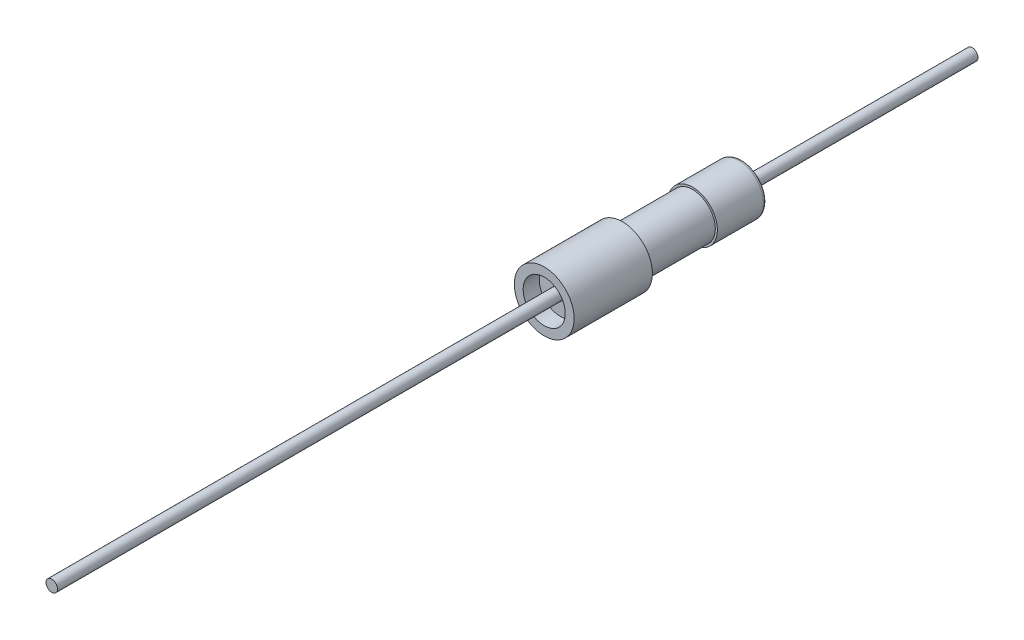
ISO-10303-21;
HEADER;
FILE_DESCRIPTION(('STEP AP214'),'2;1');
FILE_NAME('part.step','',(''),(''),'','','');
FILE_SCHEMA(('AUTOMOTIVE_DESIGN { 1 0 10303 214 1 1 1 1 }'));
ENDSEC;
DATA;
#1=APPLICATION_CONTEXT('core data for automotive mechanical design processes');
#2=APPLICATION_PROTOCOL_DEFINITION('international standard','automotive_design',2000,#1);
#3=PRODUCT_CONTEXT('',#1,'mechanical');
#4=PRODUCT('Part','Part','',(#3));
#5=PRODUCT_RELATED_PRODUCT_CATEGORY('part','',(#4));
#6=PRODUCT_DEFINITION_FORMATION('','',#4);
#7=PRODUCT_DEFINITION_CONTEXT('part definition',#1,'design');
#8=PRODUCT_DEFINITION('design','',#6,#7);
#9=PRODUCT_DEFINITION_SHAPE('','',#8);
#10=(LENGTH_UNIT() NAMED_UNIT(*) SI_UNIT(.MILLI.,.METRE.));
#11=(NAMED_UNIT(*) PLANE_ANGLE_UNIT() SI_UNIT($,.RADIAN.));
#12=(NAMED_UNIT(*) SI_UNIT($,.STERADIAN.) SOLID_ANGLE_UNIT());
#13=UNCERTAINTY_MEASURE_WITH_UNIT(LENGTH_MEASURE(1.E-05),#10,'distance_accuracy_value','');
#14=(GEOMETRIC_REPRESENTATION_CONTEXT(3) GLOBAL_UNCERTAINTY_ASSIGNED_CONTEXT((#13)) GLOBAL_UNIT_ASSIGNED_CONTEXT((#10,
#11,#12)) REPRESENTATION_CONTEXT('',''));
#15=CARTESIAN_POINT('',(0.,0.,0.));
#16=DIRECTION('',(0.,0.,1.));
#17=DIRECTION('',(1.,0.,0.));
#18=AXIS2_PLACEMENT_3D('',#15,#16,#17);
#19=CARTESIAN_POINT('',(0.,0.,-28.6996074020271));
#20=DIRECTION('',(0.,0.,1.));
#21=DIRECTION('',(0.,-1.,0.));
#22=AXIS2_PLACEMENT_3D('',#19,#20,#21);
#23=CYLINDRICAL_SURFACE('',#22,0.635000000000001);
#24=CARTESIAN_POINT('',(0.,0.,-3.29960740202708));
#25=DIRECTION('',(0.,0.,-1.));
#26=DIRECTION('',(0.,-1.,0.));
#27=AXIS2_PLACEMENT_3D('',#24,#25,#26);
#28=CIRCLE('',#27,0.635);
#29=CARTESIAN_POINT('',(0.,-0.63499999999998,-3.29960740202708));
#30=VERTEX_POINT('',#29);
#31=EDGE_CURVE('E10',#30,#30,#28,.T.);
#32=ORIENTED_EDGE('',*,*,#31,.T.);
#33=EDGE_LOOP('',(#32));
#34=FACE_BOUND('',#33,.T.);
#35=CARTESIAN_POINT('',(0.,0.,-28.6996074020271));
#36=DIRECTION('',(0.,0.,-1.));
#37=DIRECTION('',(0.,1.,0.));
#38=AXIS2_PLACEMENT_3D('',#35,#36,#37);
#39=CIRCLE('',#38,0.635000000000001);
#40=CARTESIAN_POINT('',(0.,0.635000000000018,-28.6996074020271));
#41=VERTEX_POINT('',#40);
#42=EDGE_CURVE('E31',#41,#41,#39,.T.);
#43=ORIENTED_EDGE('',*,*,#42,.F.);
#44=EDGE_LOOP('',(#43));
#45=FACE_BOUND('',#44,.T.);
#46=ADVANCED_FACE('F15',(#34,#45),#23,.T.);
#47=CARTESIAN_POINT('',(0.,0.,-28.6996074020271));
#48=DIRECTION('',(0.,0.,1.));
#49=DIRECTION('',(0.,-1.,0.));
#50=AXIS2_PLACEMENT_3D('',#47,#48,#49);
#51=CYLINDRICAL_SURFACE('',#50,0.635000000000001);
#52=CARTESIAN_POINT('',(0.,0.,72.9003925979729));
#53=DIRECTION('',(0.,0.,-1.));
#54=DIRECTION('',(0.,1.,0.));
#55=AXIS2_PLACEMENT_3D('',#52,#53,#54);
#56=CIRCLE('',#55,0.635000000000001);
#57=CARTESIAN_POINT('',(0.,0.635000000000028,72.9003925979729));
#58=VERTEX_POINT('',#57);
#59=EDGE_CURVE('E28',#58,#58,#56,.T.);
#60=ORIENTED_EDGE('',*,*,#59,.T.);
#61=EDGE_LOOP('',(#60));
#62=FACE_BOUND('',#61,.T.);
#63=CARTESIAN_POINT('',(0.,0.,-2.4698304249224));
#64=DIRECTION('',(0.,0.,1.));
#65=DIRECTION('',(0.,-1.,0.));
#66=AXIS2_PLACEMENT_3D('',#63,#64,#65);
#67=CIRCLE('',#66,0.635);
#68=CARTESIAN_POINT('',(-0.0490911625400173,0.633099563860588,-2.4698304249224));
#69=VERTEX_POINT('',#68);
#70=EDGE_CURVE('E23',#69,#69,#67,.T.);
#71=ORIENTED_EDGE('',*,*,#70,.T.);
#72=EDGE_LOOP('',(#71));
#73=FACE_BOUND('',#72,.T.);
#74=ADVANCED_FACE('F178',(#62,#73),#51,.T.);
#75=CARTESIAN_POINT('',(0.,0.,-35.0460466543635));
#76=DIRECTION('',(0.,0.,-1.));
#77=DIRECTION('',(-0.449884450199801,-0.893086771522467,0.));
#78=AXIS2_PLACEMENT_3D('',#75,#76,#77);
#79=CYLINDRICAL_SURFACE('',#78,2.32409999999999);
#80=CARTESIAN_POINT('',(0.,0.,16.764));
#81=DIRECTION('',(0.,0.,-1.));
#82=DIRECTION('',(1.,0.,0.));
#83=AXIS2_PLACEMENT_3D('',#80,#81,#82);
#84=CIRCLE('',#83,2.32409999999999);
#85=CARTESIAN_POINT('',(2.32409999999999,0.,16.764));
#86=VERTEX_POINT('',#85);
#87=EDGE_CURVE('E35',#86,#86,#84,.T.);
#88=ORIENTED_EDGE('',*,*,#87,.T.);
#89=EDGE_LOOP('',(#88));
#90=FACE_BOUND('',#89,.T.);
#91=CARTESIAN_POINT('',(0.,0.,18.5443925979729));
#92=DIRECTION('',(0.,0.,-1.));
#93=DIRECTION('',(-0.449884450199801,-0.893086771522467,0.));
#94=AXIS2_PLACEMENT_3D('',#91,#92,#93);
#95=CIRCLE('',#94,2.32409999999999);
#96=CARTESIAN_POINT('',(-1.04557645070935,-2.07562296569535,18.5443925979729));
#97=VERTEX_POINT('',#96);
#98=EDGE_CURVE('E36',#97,#97,#95,.T.);
#99=ORIENTED_EDGE('',*,*,#98,.F.);
#100=EDGE_LOOP('',(#99));
#101=FACE_BOUND('',#100,.T.);
#102=ADVANCED_FACE('F174',(#90,#101),#79,.F.);
#103=CARTESIAN_POINT('',(0.,0.,-19.6873550655785));
#104=DIRECTION('',(0.,0.,-1.));
#105=DIRECTION('',(-0.449884450199801,-0.893086771522467,0.));
#106=AXIS2_PLACEMENT_3D('',#103,#104,#105);
#107=CYLINDRICAL_SURFACE('',#106,3.302);
#108=CARTESIAN_POINT('',(0.,0.,9.90839259797293));
#109=DIRECTION('',(0.,0.,-1.));
#110=DIRECTION('',(-0.449884450199801,-0.893086771522467,0.));
#111=AXIS2_PLACEMENT_3D('',#108,#109,#110);
#112=CIRCLE('',#111,3.302);
#113=CARTESIAN_POINT('',(-1.48551845455974,-2.94897251956717,9.90839259797293));
#114=VERTEX_POINT('',#113);
#115=EDGE_CURVE('E39',#114,#114,#112,.T.);
#116=ORIENTED_EDGE('',*,*,#115,.F.);
#117=EDGE_LOOP('',(#116));
#118=FACE_BOUND('',#117,.T.);
#119=CARTESIAN_POINT('',(0.,0.,18.5443925979729));
#120=DIRECTION('',(0.,0.,-1.));
#121=DIRECTION('',(-0.449884450199801,-0.893086771522467,0.));
#122=AXIS2_PLACEMENT_3D('',#119,#120,#121);
#123=CIRCLE('',#122,3.302);
#124=CARTESIAN_POINT('',(-1.48551845455974,-2.94897251956717,18.5443925979729));
#125=VERTEX_POINT('',#124);
#126=EDGE_CURVE('E42',#125,#125,#123,.T.);
#127=ORIENTED_EDGE('',*,*,#126,.T.);
#128=EDGE_LOOP('',(#127));
#129=FACE_BOUND('',#128,.T.);
#130=ADVANCED_FACE('F170',(#118,#129),#107,.T.);
#131=CARTESIAN_POINT('',(0.,0.,16.764));
#132=DIRECTION('',(0.,0.,-1.));
#133=DIRECTION('',(-1.,0.,0.));
#134=AXIS2_PLACEMENT_3D('',#131,#132,#133);
#135=CYLINDRICAL_SURFACE('',#134,0.762);
#136=CARTESIAN_POINT('',(0.,0.,0.));
#137=DIRECTION('',(0.,0.,1.));
#138=DIRECTION('',(1.,0.,0.));
#139=AXIS2_PLACEMENT_3D('',#136,#137,#138);
#140=CIRCLE('',#139,0.762);
#141=CARTESIAN_POINT('',(0.762,0.,0.));
#142=VERTEX_POINT('',#141);
#143=EDGE_CURVE('E52',#142,#142,#140,.T.);
#144=ORIENTED_EDGE('',*,*,#143,.F.);
#145=EDGE_LOOP('',(#144));
#146=FACE_BOUND('',#145,.T.);
#147=CARTESIAN_POINT('',(0.,0.,16.764));
#148=DIRECTION('',(0.,0.,1.));
#149=DIRECTION('',(1.,0.,0.));
#150=AXIS2_PLACEMENT_3D('',#147,#148,#149);
#151=CIRCLE('',#150,0.762);
#152=CARTESIAN_POINT('',(0.762,0.,16.764));
#153=VERTEX_POINT('',#152);
#154=EDGE_CURVE('E45',#153,#153,#151,.T.);
#155=ORIENTED_EDGE('',*,*,#154,.T.);
#156=EDGE_LOOP('',(#155));
#157=FACE_BOUND('',#156,.T.);
#158=ADVANCED_FACE('F166',(#146,#157),#135,.F.);
#159=CARTESIAN_POINT('',(0.,0.,16.764));
#160=DIRECTION('',(0.,0.,-1.));
#161=DIRECTION('',(-1.,0.,0.));
#162=AXIS2_PLACEMENT_3D('',#159,#160,#161);
#163=CYLINDRICAL_SURFACE('',#162,2.5019);
#164=CARTESIAN_POINT('',(0.,0.,2.16139259797292));
#165=DIRECTION('',(0.,0.,1.));
#166=DIRECTION('',(0.,1.,0.));
#167=AXIS2_PLACEMENT_3D('',#164,#165,#166);
#168=CIRCLE('',#167,2.5019);
#169=CARTESIAN_POINT('',(0.,2.5019,2.16139259797292));
#170=VERTEX_POINT('',#169);
#171=EDGE_CURVE('E58',#170,#170,#168,.T.);
#172=ORIENTED_EDGE('',*,*,#171,.T.);
#173=EDGE_LOOP('',(#172));
#174=FACE_BOUND('',#173,.T.);
#175=CARTESIAN_POINT('',(0.,0.,9.90839259797293));
#176=DIRECTION('',(0.,0.,-1.));
#177=DIRECTION('',(0.,1.,0.));
#178=AXIS2_PLACEMENT_3D('',#175,#176,#177);
#179=CIRCLE('',#178,2.5019);
#180=CARTESIAN_POINT('',(0.,2.5019,9.90839259797293));
#181=VERTEX_POINT('',#180);
#182=EDGE_CURVE('E51',#181,#181,#179,.T.);
#183=ORIENTED_EDGE('',*,*,#182,.T.);
#184=EDGE_LOOP('',(#183));
#185=FACE_BOUND('',#184,.T.);
#186=ADVANCED_FACE('F162',(#174,#185),#163,.T.);
#187=CARTESIAN_POINT('',(0.,0.,-18.5396074020271));
#188=DIRECTION('',(0.,0.,-1.));
#189=DIRECTION('',(0.077308917385854,-0.997007187182032,0.));
#190=AXIS2_PLACEMENT_3D('',#187,#188,#189);
#191=CYLINDRICAL_SURFACE('',#190,2.0574);
#192=CARTESIAN_POINT('',(0.,0.,-1.64860740202708));
#193=DIRECTION('',(0.,0.,-1.));
#194=DIRECTION('',(0.077308917385854,-0.997007187182032,0.));
#195=AXIS2_PLACEMENT_3D('',#192,#193,#194);
#196=CIRCLE('',#195,2.0574);
#197=CARTESIAN_POINT('',(-0.159055366629656,2.05124258690831,-1.64860740202708));
#198=VERTEX_POINT('',#197);
#199=EDGE_CURVE('E61',#198,#198,#196,.T.);
#200=ORIENTED_EDGE('',*,*,#199,.T.);
#201=EDGE_LOOP('',(#200));
#202=FACE_BOUND('',#201,.T.);
#203=CARTESIAN_POINT('',(0.,0.,-0.22620740202708));
#204=DIRECTION('',(0.,0.,-1.));
#205=DIRECTION('',(0.077308917385854,-0.997007187182032,0.));
#206=AXIS2_PLACEMENT_3D('',#203,#204,#205);
#207=CIRCLE('',#206,2.0574);
#208=CARTESIAN_POINT('',(0.159055366629656,-2.05124258690832,-0.22620740202708));
#209=VERTEX_POINT('',#208);
#210=EDGE_CURVE('E62',#209,#209,#207,.T.);
#211=ORIENTED_EDGE('',*,*,#210,.F.);
#212=EDGE_LOOP('',(#211));
#213=FACE_BOUND('',#212,.T.);
#214=ADVANCED_FACE('F158',(#202,#213),#191,.F.);
#215=CARTESIAN_POINT('',(0.,0.,-18.5396074020271));
#216=DIRECTION('',(0.,0.,-1.));
#217=DIRECTION('',(0.0773089173858539,-0.997007187182032,0.));
#218=AXIS2_PLACEMENT_3D('',#215,#216,#217);
#219=CYLINDRICAL_SURFACE('',#218,2.7305);
#220=CARTESIAN_POINT('',(0.,0.,-2.91860740202708));
#221=DIRECTION('',(0.,0.,-1.));
#222=DIRECTION('',(0.0773089173858539,-0.997007187182032,0.));
#223=AXIS2_PLACEMENT_3D('',#220,#221,#222);
#224=CIRCLE('',#223,2.7305);
#225=CARTESIAN_POINT('',(0.211091998922074,-2.72232812460054,-2.91860740202708));
#226=VERTEX_POINT('',#225);
#227=EDGE_CURVE('E65',#226,#226,#224,.T.);
#228=ORIENTED_EDGE('',*,*,#227,.F.);
#229=EDGE_LOOP('',(#228));
#230=FACE_BOUND('',#229,.T.);
#231=CARTESIAN_POINT('',(0.,0.,2.16139259797292));
#232=DIRECTION('',(0.,0.,-1.));
#233=DIRECTION('',(0.077308917385854,-0.997007187182032,0.));
#234=AXIS2_PLACEMENT_3D('',#231,#232,#233);
#235=CIRCLE('',#234,2.7305);
#236=CARTESIAN_POINT('',(0.211091998922074,-2.72232812460054,2.16139259797292));
#237=VERTEX_POINT('',#236);
#238=EDGE_CURVE('E68',#237,#237,#235,.T.);
#239=ORIENTED_EDGE('',*,*,#238,.T.);
#240=EDGE_LOOP('',(#239));
#241=FACE_BOUND('',#240,.T.);
#242=ADVANCED_FACE('F154',(#230,#241),#219,.T.);
#243=CARTESIAN_POINT('',(0.,0.,-2.91860740202708));
#244=DIRECTION('',(0.,0.,-1.));
#245=DIRECTION('',(0.077308917385854,-0.997007187182032,0.));
#246=AXIS2_PLACEMENT_3D('',#243,#244,#245);
#247=TOROIDAL_SURFACE('',#246,2.3495,0.381);
#248=CARTESIAN_POINT('',(0.,0.,-3.29960740202708));
#249=DIRECTION('',(0.,0.,-1.));
#250=DIRECTION('',(0.0773089173858539,-0.997007187182032,0.));
#251=AXIS2_PLACEMENT_3D('',#248,#249,#250);
#252=CIRCLE('',#251,2.3495);
#253=CARTESIAN_POINT('',(0.181637301398064,-2.34246838628419,-3.29960740202708));
#254=VERTEX_POINT('',#253);
#255=EDGE_CURVE('E55',#254,#254,#252,.T.);
#256=ORIENTED_EDGE('',*,*,#255,.F.);
#257=EDGE_LOOP('',(#256));
#258=FACE_BOUND('',#257,.T.);
#259=ORIENTED_EDGE('',*,*,#227,.T.);
#260=EDGE_LOOP('',(#259));
#261=FACE_BOUND('',#260,.T.);
#262=ADVANCED_FACE('F150',(#258,#261),#247,.T.);
#263=CARTESIAN_POINT('',(0.,0.,-0.22620740202708));
#264=DIRECTION('',(0.,0.,1.));
#265=DIRECTION('',(-0.077308917385854,0.997007187182032,0.));
#266=AXIS2_PLACEMENT_3D('',#263,#264,#265);
#267=CONICAL_SURFACE('',#266,2.0574,0.785398163397444);
#268=CARTESIAN_POINT('',(0.,0.,0.));
#269=DIRECTION('',(0.,0.,-1.));
#270=DIRECTION('',(1.,0.,0.));
#271=AXIS2_PLACEMENT_3D('',#268,#269,#270);
#272=CIRCLE('',#271,2.28360740202708);
#273=CARTESIAN_POINT('',(2.28360740202708,0.,0.));
#274=VERTEX_POINT('',#273);
#275=EDGE_CURVE('E48',#274,#274,#272,.T.);
#276=ORIENTED_EDGE('',*,*,#275,.F.);
#277=EDGE_LOOP('',(#276));
#278=FACE_BOUND('',#277,.T.);
#279=ORIENTED_EDGE('',*,*,#210,.T.);
#280=EDGE_LOOP('',(#279));
#281=FACE_BOUND('',#280,.T.);
#282=ADVANCED_FACE('F146',(#278,#281),#267,.F.);
#283=CARTESIAN_POINT('',(0.,0.,-2.52848921227206));
#284=DIRECTION('',(0.,0.,1.));
#285=DIRECTION('',(-0.077308917385854,0.997007187182032,0.));
#286=AXIS2_PLACEMENT_3D('',#283,#284,#285);
#287=CONICAL_SURFACE('',#286,0.533400000000002,1.0471975511966);
#288=CARTESIAN_POINT('',(-0.159055366629656,2.05124258690831,-1.64860740202708));
#289=CARTESIAN_POINT('',(-0.157909906170389,2.03647026375157,-1.65716180851557));
#290=CARTESIAN_POINT('',(-0.156764445711122,2.02169794059482,-1.66571621500406));
#291=CARTESIAN_POINT('',(-0.154473524792588,1.99215329428132,-1.68282502798105));
#292=CARTESIAN_POINT('',(-0.153328064333321,1.97738097112458,-1.69137943446954));
#293=CARTESIAN_POINT('',(-0.151037143414787,1.94783632481108,-1.70848824744653));
#294=CARTESIAN_POINT('',(-0.14989168295552,1.93306400165434,-1.71704265393502));
#295=CARTESIAN_POINT('',(-0.147600762036985,1.90351935534084,-1.73415146691201));
#296=CARTESIAN_POINT('',(-0.146455301577718,1.88874703218409,-1.7427058734005));
#297=CARTESIAN_POINT('',(-0.144164380659184,1.8592023858706,-1.75981468637749));
#298=CARTESIAN_POINT('',(-0.143018920199917,1.84443006271385,-1.76836909286598));
#299=CARTESIAN_POINT('',(-0.140727999281383,1.81488541640036,-1.78547790584296));
#300=CARTESIAN_POINT('',(-0.139582538822116,1.80011309324361,-1.79403231233146));
#301=CARTESIAN_POINT('',(-0.137291617903582,1.77056844693012,-1.81114112530844));
#302=CARTESIAN_POINT('',(-0.136146157444315,1.75579612377337,-1.81969553179694));
#303=CARTESIAN_POINT('',(-0.133855236525781,1.72625147745988,-1.83680434477392));
#304=CARTESIAN_POINT('',(-0.132709776066513,1.71147915430313,-1.84535875126241));
#305=CARTESIAN_POINT('',(-0.130418855147979,1.68193450798963,-1.8624675642394));
#306=CARTESIAN_POINT('',(-0.129273394688712,1.66716218483289,-1.87102197072789));
#307=CARTESIAN_POINT('',(-0.126982473770178,1.63761753851939,-1.88813078370488));
#308=CARTESIAN_POINT('',(-0.125837013310911,1.62284521536265,-1.89668519019337));
#309=CARTESIAN_POINT('',(-0.123546092392377,1.59330056904915,-1.91379400317036));
#310=CARTESIAN_POINT('',(-0.12240063193311,1.5785282458924,-1.92234840965885));
#311=CARTESIAN_POINT('',(-0.120109711014576,1.54898359957891,-1.93945722263584));
#312=CARTESIAN_POINT('',(-0.118964250555309,1.53421127642216,-1.94801162912433));
#313=CARTESIAN_POINT('',(-0.116673329636774,1.50466663010867,-1.96512044210132));
#314=CARTESIAN_POINT('',(-0.115527869177507,1.48989430695192,-1.97367484858981));
#315=CARTESIAN_POINT('',(-0.113236948258973,1.46034966063843,-1.99078366156679));
#316=CARTESIAN_POINT('',(-0.112091487799706,1.44557733748168,-1.99933806805529));
#317=CARTESIAN_POINT('',(-0.109800566881172,1.41603269116819,-2.01644688103227));
#318=CARTESIAN_POINT('',(-0.108655106421905,1.40126036801144,-2.02500128752077));
#319=CARTESIAN_POINT('',(-0.106364185503371,1.37171572169794,-2.04211010049775));
#320=CARTESIAN_POINT('',(-0.105218725044104,1.3569433985412,-2.05066450698624));
#321=CARTESIAN_POINT('',(-0.10292780412557,1.3273987522277,-2.06777331996323));
#322=CARTESIAN_POINT('',(-0.101782343666303,1.31262642907096,-2.07632772645172));
#323=CARTESIAN_POINT('',(-0.0994914227477684,1.28308178275746,-2.09343653942871));
#324=CARTESIAN_POINT('',(-0.0983459622885013,1.26830945960071,-2.1019909459172));
#325=CARTESIAN_POINT('',(-0.0960550413699672,1.23876481328722,-2.11909975889419));
#326=CARTESIAN_POINT('',(-0.0949095809107001,1.22399249013047,-2.12765416538268));
#327=CARTESIAN_POINT('',(-0.092618659992166,1.19444784381698,-2.14476297835967));
#328=CARTESIAN_POINT('',(-0.0914731995328989,1.17967552066023,-2.15331738484816));
#329=CARTESIAN_POINT('',(-0.0891822786143647,1.15013087434674,-2.17042619782515));
#330=CARTESIAN_POINT('',(-0.0880368181550977,1.13535855118999,-2.17898060431364));
#331=CARTESIAN_POINT('',(-0.0857458972365635,1.1058139048765,-2.19608941729062));
#332=CARTESIAN_POINT('',(-0.0846004367772965,1.09104158171975,-2.20464382377912));
#333=CARTESIAN_POINT('',(-0.0823095158587623,1.06149693540625,-2.2217526367561));
#334=CARTESIAN_POINT('',(-0.0811640553994953,1.04672461224951,-2.2303070432446));
#335=CARTESIAN_POINT('',(-0.0788731344809611,1.01717996593601,-2.24741585622158));
#336=CARTESIAN_POINT('',(-0.077727674021694,1.00240764277927,-2.25597026271007));
#337=CARTESIAN_POINT('',(-0.0754367531031599,0.972862996465772,-2.27307907568706));
#338=CARTESIAN_POINT('',(-0.0742912926438928,0.958090673309024,-2.28163348217555));
#339=CARTESIAN_POINT('',(-0.0720003717253587,0.92854602699553,-2.29874229515254));
#340=CARTESIAN_POINT('',(-0.0708549112660916,0.913773703838783,-2.30729670164103));
#341=CARTESIAN_POINT('',(-0.0685639903475575,0.884229057525289,-2.32440551461802));
#342=CARTESIAN_POINT('',(-0.0674185298882904,0.869456734368542,-2.33295992110651));
#343=CARTESIAN_POINT('',(-0.0651276089697563,0.839912088055047,-2.3500687340835));
#344=CARTESIAN_POINT('',(-0.0639821485104892,0.8251397648983,-2.35862314057199));
#345=CARTESIAN_POINT('',(-0.061691227591955,0.795595118584806,-2.37573195354898));
#346=CARTESIAN_POINT('',(-0.060545767132688,0.780822795428059,-2.38428636003747));
#347=CARTESIAN_POINT('',(-0.0582548462141538,0.751278149114565,-2.40139517301445));
#348=CARTESIAN_POINT('',(-0.0571093857548868,0.736505825957818,-2.40994957950295));
#349=CARTESIAN_POINT('',(-0.0548184648363526,0.706961179644323,-2.42705839247993));
#350=CARTESIAN_POINT('',(-0.0536730043770855,0.692188856487576,-2.43561279896843));
#351=CARTESIAN_POINT('',(-0.0513820834585514,0.662644210174082,-2.45272161194541));
#352=CARTESIAN_POINT('',(-0.0502366229992843,0.647871887017335,-2.4612760184339));
#353=CARTESIAN_POINT('',(-0.0490911625400173,0.633099563860588,-2.4698304249224));
#354=B_SPLINE_CURVE_WITH_KNOTS('',3,(#288,#289,#290,#291,#292,#293,#294,#295,#296,#297,#298,
#299,#300,#301,#302,#303,#304,#305,#306,#307,#308,#309,#310,#311,#312,#313,#314,#315,#316,#317,
#318,#319,#320,#321,#322,#323,#324,#325,#326,#327,#328,#329,#330,#331,#332,#333,#334,#335,#336,
#337,#338,#339,#340,#341,#342,#343,#344,#345,#346,#347,#348,#349,#350,#351,#352,#353),
.UNSPECIFIED.,.F.,.F.,(4,2,2,2,2,2,2,2,2,2,2,2,2,2,2,2,2,2,2,2,2,2,2,2,2,2,2,2,2,2,2,2,4),(0.,
0.0513264389309578,0.102652877861916,0.153979316792873,0.205305755723831,0.256632194654789,
0.307958633585747,0.359285072516704,0.410611511447662,0.461937950378619,0.513264389309577,
0.564590828240535,0.615917267171493,0.667243706102451,0.718570145033408,0.769896583964366,
0.821223022895324,0.872549461826281,0.92387590075724,0.975202339688197,1.02652877861916,
1.07785521755011,1.12918165648107,1.18050809541203,1.23183453434299,1.28316097327394,
1.3344874122049,1.38581385113586,1.43714029006682,1.48846672899777,1.53979316792873,
1.59111960685969,1.64244604579065),.UNSPECIFIED.);
#355=EDGE_CURVE('BSEAM142',#198,#69,#354,.T.);
#356=ORIENTED_EDGE('',*,*,#199,.F.);
#357=ORIENTED_EDGE('',*,*,#70,.F.);
#358=ORIENTED_EDGE('',*,*,#355,.T.);
#359=ORIENTED_EDGE('',*,*,#355,.F.);
#360=EDGE_LOOP('',(#356,#358,#357,#359));
#361=FACE_BOUND('',#360,.T.);
#362=ADVANCED_FACE('F142',(#361),#287,.F.);
#363=CARTESIAN_POINT('',(-2.34246838628419,-0.181637301398066,-3.29960740202708));
#364=DIRECTION('',(0.,0.,1.));
#365=DIRECTION('',(-0.077308917385854,0.997007187182032,0.));
#366=AXIS2_PLACEMENT_3D('',#363,#364,#365);
#367=PLANE('',#366);
#368=ORIENTED_EDGE('',*,*,#255,.T.);
#369=EDGE_LOOP('',(#368));
#370=FACE_BOUND('',#369,.T.);
#371=ORIENTED_EDGE('',*,*,#31,.F.);
#372=EDGE_LOOP('',(#371));
#373=FACE_BOUND('',#372,.T.);
#374=ADVANCED_FACE('F138',(#370,#373),#367,.F.);
#375=CARTESIAN_POINT('',(-2.27915842989813,-0.176728185144064,2.16139259797292));
#376=DIRECTION('',(0.,0.,-1.));
#377=DIRECTION('',(0.077308917385854,-0.997007187182032,0.));
#378=AXIS2_PLACEMENT_3D('',#375,#376,#377);
#379=PLANE('',#378);
#380=ORIENTED_EDGE('',*,*,#238,.F.);
#381=EDGE_LOOP('',(#380));
#382=FACE_BOUND('',#381,.T.);
#383=ORIENTED_EDGE('',*,*,#171,.F.);
#384=EDGE_LOOP('',(#383));
#385=FACE_BOUND('',#384,.T.);
#386=ADVANCED_FACE('F134',(#382,#385),#379,.F.);
#387=CARTESIAN_POINT('',(0.,0.,0.));
#388=DIRECTION('',(0.,0.,1.));
#389=DIRECTION('',(1.,0.,0.));
#390=AXIS2_PLACEMENT_3D('',#387,#388,#389);
#391=PLANE('',#390);
#392=ORIENTED_EDGE('',*,*,#143,.T.);
#393=EDGE_LOOP('',(#392));
#394=FACE_BOUND('',#393,.T.);
#395=ORIENTED_EDGE('',*,*,#275,.T.);
#396=EDGE_LOOP('',(#395));
#397=FACE_BOUND('',#396,.T.);
#398=ADVANCED_FACE('F130',(#394,#397),#391,.F.);
#399=CARTESIAN_POINT('',(0.,0.,16.764));
#400=DIRECTION('',(0.,0.,1.));
#401=DIRECTION('',(1.,0.,0.));
#402=AXIS2_PLACEMENT_3D('',#399,#400,#401);
#403=PLANE('',#402);
#404=ORIENTED_EDGE('',*,*,#87,.F.);
#405=EDGE_LOOP('',(#404));
#406=FACE_BOUND('',#405,.T.);
#407=ORIENTED_EDGE('',*,*,#154,.F.);
#408=EDGE_LOOP('',(#407));
#409=FACE_BOUND('',#408,.T.);
#410=ADVANCED_FACE('F126',(#406,#409),#403,.T.);
#411=CARTESIAN_POINT('',(2.94897251956718,-1.48551845455973,9.90839259797293));
#412=DIRECTION('',(0.,0.,-1.));
#413=DIRECTION('',(-0.449884450199801,-0.893086771522467,0.));
#414=AXIS2_PLACEMENT_3D('',#411,#412,#413);
#415=PLANE('',#414);
#416=ORIENTED_EDGE('',*,*,#115,.T.);
#417=EDGE_LOOP('',(#416));
#418=FACE_BOUND('',#417,.T.);
#419=ORIENTED_EDGE('',*,*,#182,.F.);
#420=EDGE_LOOP('',(#419));
#421=FACE_BOUND('',#420,.T.);
#422=ADVANCED_FACE('F122',(#418,#421),#415,.T.);
#423=CARTESIAN_POINT('',(2.94897251956718,-1.48551845455973,18.5443925979729));
#424=DIRECTION('',(0.,0.,1.));
#425=DIRECTION('',(0.449884450199801,0.893086771522467,0.));
#426=AXIS2_PLACEMENT_3D('',#423,#424,#425);
#427=PLANE('',#426);
#428=ORIENTED_EDGE('',*,*,#98,.T.);
#429=EDGE_LOOP('',(#428));
#430=FACE_BOUND('',#429,.T.);
#431=ORIENTED_EDGE('',*,*,#126,.F.);
#432=EDGE_LOOP('',(#431));
#433=FACE_BOUND('',#432,.T.);
#434=ADVANCED_FACE('F118',(#430,#433),#427,.T.);
#435=CARTESIAN_POINT('',(0.,0.,72.9003925979729));
#436=DIRECTION('',(0.,0.,-1.));
#437=DIRECTION('',(0.,1.,0.));
#438=AXIS2_PLACEMENT_3D('',#435,#436,#437);
#439=PLANE('',#438);
#440=ORIENTED_EDGE('',*,*,#59,.F.);
#441=EDGE_LOOP('',(#440));
#442=FACE_BOUND('',#441,.T.);
#443=ADVANCED_FACE('F114',(#442),#439,.F.);
#444=CARTESIAN_POINT('',(0.,0.,-28.6996074020271));
#445=DIRECTION('',(0.,0.,-1.));
#446=DIRECTION('',(0.,1.,0.));
#447=AXIS2_PLACEMENT_3D('',#444,#445,#446);
#448=PLANE('',#447);
#449=ORIENTED_EDGE('',*,*,#42,.T.);
#450=EDGE_LOOP('',(#449));
#451=FACE_BOUND('',#450,.T.);
#452=ADVANCED_FACE('F112',(#451),#448,.T.);
#453=CLOSED_SHELL('',(#46,#74,#102,#130,#158,#186,#214,#242,#262,#282,#362,#374,#386,#398,#410,
#422,#434,#443,#452));
#454=CARTESIAN_POINT('',(0.,0.,13.8453925979729));
#455=DIRECTION('',(0.,0.,1.));
#456=DIRECTION('',(0.449884450199801,0.893086771522467,0.));
#457=AXIS2_PLACEMENT_3D('',#454,#455,#456);
#458=CONICAL_SURFACE('',#457,2.32409999999999,0.785398163397454);
#459=CARTESIAN_POINT('',(0.,0.,14.2898925979729));
#460=DIRECTION('',(0.,0.,-1.));
#461=DIRECTION('',(0.,-1.,0.));
#462=AXIS2_PLACEMENT_3D('',#459,#460,#461);
#463=CIRCLE('',#462,2.7686);
#464=CARTESIAN_POINT('',(0.,-2.76859999999999,14.2898925979729));
#465=VERTEX_POINT('',#464);
#466=EDGE_CURVE('E80',#465,#465,#463,.T.);
#467=ORIENTED_EDGE('',*,*,#466,.T.);
#468=EDGE_LOOP('',(#467));
#469=FACE_BOUND('',#468,.T.);
#470=CARTESIAN_POINT('',(0.,0.,14.0231925979729));
#471=DIRECTION('',(0.,0.,-1.));
#472=DIRECTION('',(0.,-1.,0.));
#473=AXIS2_PLACEMENT_3D('',#470,#471,#472);
#474=CIRCLE('',#473,2.5019);
#475=CARTESIAN_POINT('',(0.,-2.50189999999999,14.0231925979729));
#476=VERTEX_POINT('',#475);
#477=EDGE_CURVE('E77',#476,#476,#474,.T.);
#478=ORIENTED_EDGE('',*,*,#477,.F.);
#479=EDGE_LOOP('',(#478));
#480=FACE_BOUND('',#479,.T.);
#481=ADVANCED_FACE('F100',(#469,#480),#458,.T.);
#482=CARTESIAN_POINT('',(0.,0.,-19.6873550655785));
#483=DIRECTION('',(0.,0.,-1.));
#484=DIRECTION('',(-0.449884450199801,-0.893086771522467,0.));
#485=AXIS2_PLACEMENT_3D('',#482,#483,#484);
#486=CYLINDRICAL_SURFACE('',#485,2.7686);
#487=CARTESIAN_POINT('',(0.,0.,12.4483925979729));
#488=DIRECTION('',(0.,0.,-1.));
#489=DIRECTION('',(-0.449884450199801,-0.893086771522467,0.));
#490=AXIS2_PLACEMENT_3D('',#487,#488,#489);
#491=CIRCLE('',#490,2.7686);
#492=CARTESIAN_POINT('',(-1.24555008882317,-2.47260003563709,12.4483925979729));
#493=VERTEX_POINT('',#492);
#494=EDGE_CURVE('E82',#493,#493,#491,.T.);
#495=ORIENTED_EDGE('',*,*,#494,.T.);
#496=EDGE_LOOP('',(#495));
#497=FACE_BOUND('',#496,.T.);
#498=ORIENTED_EDGE('',*,*,#466,.F.);
#499=EDGE_LOOP('',(#498));
#500=FACE_BOUND('',#499,.T.);
#501=ADVANCED_FACE('F99',(#497,#500),#486,.F.);
#502=CARTESIAN_POINT('',(0.,0.,16.764));
#503=DIRECTION('',(0.,0.,-1.));
#504=DIRECTION('',(-1.,0.,0.));
#505=AXIS2_PLACEMENT_3D('',#502,#503,#504);
#506=CYLINDRICAL_SURFACE('',#505,2.5019);
#507=CARTESIAN_POINT('',(0.,0.,12.4483925979729));
#508=DIRECTION('',(0.,0.,1.));
#509=DIRECTION('',(0.,-1.,0.));
#510=AXIS2_PLACEMENT_3D('',#507,#508,#509);
#511=CIRCLE('',#510,2.5019);
#512=CARTESIAN_POINT('',(0.,-2.5019,12.4483925979729));
#513=VERTEX_POINT('',#512);
#514=EDGE_CURVE('E19',#513,#513,#511,.T.);
#515=ORIENTED_EDGE('',*,*,#514,.T.);
#516=EDGE_LOOP('',(#515));
#517=FACE_BOUND('',#516,.T.);
#518=ORIENTED_EDGE('',*,*,#477,.T.);
#519=EDGE_LOOP('',(#518));
#520=FACE_BOUND('',#519,.T.);
#521=ADVANCED_FACE('F89',(#517,#520),#506,.T.);
#522=CARTESIAN_POINT('',(2.00756975370535,-1.01129525560412,12.4483925979729));
#523=DIRECTION('',(0.,0.,1.));
#524=DIRECTION('',(0.449884450199801,0.893086771522467,0.));
#525=AXIS2_PLACEMENT_3D('',#522,#523,#524);
#526=PLANE('',#525);
#527=ORIENTED_EDGE('',*,*,#494,.F.);
#528=EDGE_LOOP('',(#527));
#529=FACE_BOUND('',#528,.T.);
#530=ORIENTED_EDGE('',*,*,#514,.F.);
#531=EDGE_LOOP('',(#530));
#532=FACE_BOUND('',#531,.T.);
#533=ADVANCED_FACE('F17',(#529,#532),#526,.T.);
#534=CLOSED_SHELL('',(#481,#501,#521,#533));
#535=ORIENTED_CLOSED_SHELL('',*,#534,.T.);
#536=BREP_WITH_VOIDS('B1',#453,(#535));
#537=ADVANCED_BREP_SHAPE_REPRESENTATION('',(#18,#536),#14);
#538=SHAPE_DEFINITION_REPRESENTATION(#9,#537);
ENDSEC;
END-ISO-10303-21;
